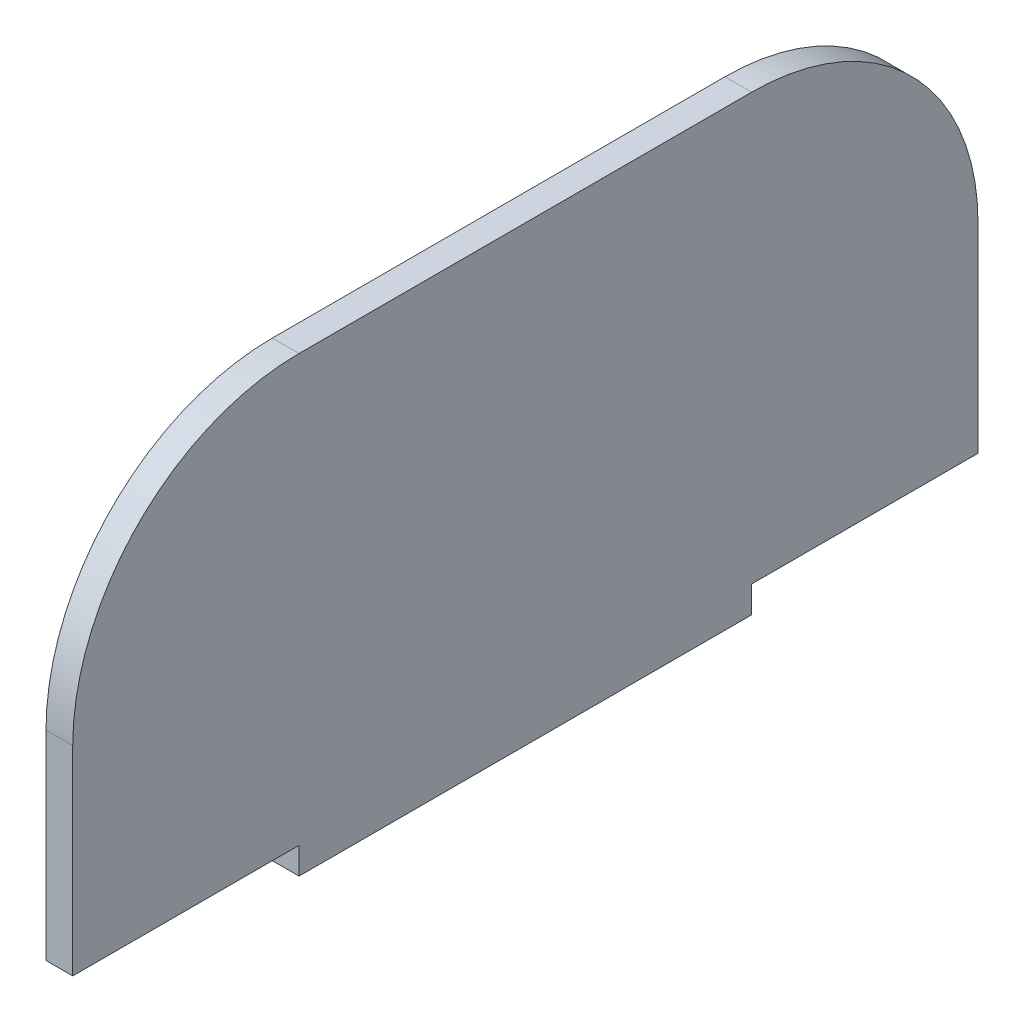
ISO-10303-21;
HEADER;
FILE_DESCRIPTION(('STEP AP214'),'2;1');
FILE_NAME('part.step','',(''),(''),'','','');
FILE_SCHEMA(('AUTOMOTIVE_DESIGN { 1 0 10303 214 1 1 1 1 }'));
ENDSEC;
DATA;
#1=APPLICATION_CONTEXT('core data for automotive mechanical design processes');
#2=APPLICATION_PROTOCOL_DEFINITION('international standard','automotive_design',2000,#1);
#3=PRODUCT_CONTEXT('',#1,'mechanical');
#4=PRODUCT('Part','Part','',(#3));
#5=PRODUCT_RELATED_PRODUCT_CATEGORY('part','',(#4));
#6=PRODUCT_DEFINITION_FORMATION('','',#4);
#7=PRODUCT_DEFINITION_CONTEXT('part definition',#1,'design');
#8=PRODUCT_DEFINITION('design','',#6,#7);
#9=PRODUCT_DEFINITION_SHAPE('','',#8);
#10=(LENGTH_UNIT() NAMED_UNIT(*) SI_UNIT(.MILLI.,.METRE.));
#11=(NAMED_UNIT(*) PLANE_ANGLE_UNIT() SI_UNIT($,.RADIAN.));
#12=(NAMED_UNIT(*) SI_UNIT($,.STERADIAN.) SOLID_ANGLE_UNIT());
#13=UNCERTAINTY_MEASURE_WITH_UNIT(LENGTH_MEASURE(1.E-05),#10,'distance_accuracy_value','');
#14=(GEOMETRIC_REPRESENTATION_CONTEXT(3) GLOBAL_UNCERTAINTY_ASSIGNED_CONTEXT((#13)) GLOBAL_UNIT_ASSIGNED_CONTEXT((#10,
#11,#12)) REPRESENTATION_CONTEXT('',''));
#15=CARTESIAN_POINT('',(0.,0.,0.));
#16=DIRECTION('',(0.,0.,1.));
#17=DIRECTION('',(1.,0.,0.));
#18=AXIS2_PLACEMENT_3D('',#15,#16,#17);
#19=CARTESIAN_POINT('',(3.,0.,0.));
#20=DIRECTION('',(0.,0.,-1.));
#21=DIRECTION('',(-1.,0.,0.));
#22=AXIS2_PLACEMENT_3D('',#19,#20,#21);
#23=PLANE('',#22);
#24=DIRECTION('',(0.,-1.,0.));
#25=VECTOR('',#24,1.);
#26=CARTESIAN_POINT('',(0.,0.,0.));
#27=LINE('',#26,#25);
#28=CARTESIAN_POINT('',(0.,25.4,0.));
#29=VERTEX_POINT('',#28);
#30=CARTESIAN_POINT('',(0.,3.,0.));
#31=VERTEX_POINT('',#30);
#32=EDGE_CURVE('E132',#29,#31,#27,.T.);
#33=ORIENTED_EDGE('',*,*,#32,.T.);
#34=DIRECTION('',(1.,0.,0.));
#35=VECTOR('',#34,1.);
#36=CARTESIAN_POINT('',(0.,3.,0.));
#37=LINE('',#36,#35);
#38=CARTESIAN_POINT('',(3.,3.,0.));
#39=VERTEX_POINT('',#38);
#40=EDGE_CURVE('E137',#31,#39,#37,.T.);
#41=ORIENTED_EDGE('',*,*,#40,.T.);
#42=DIRECTION('',(0.,-1.,0.));
#43=VECTOR('',#42,1.);
#44=CARTESIAN_POINT('',(3.,0.,0.));
#45=LINE('',#44,#43);
#46=CARTESIAN_POINT('',(3.,25.4,0.));
#47=VERTEX_POINT('',#46);
#48=EDGE_CURVE('E143',#47,#39,#45,.T.);
#49=ORIENTED_EDGE('',*,*,#48,.F.);
#50=DIRECTION('',(-1.,0.,0.));
#51=VECTOR('',#50,1.);
#52=CARTESIAN_POINT('',(3.,25.4,0.));
#53=LINE('',#52,#51);
#54=EDGE_CURVE('E11',#47,#29,#53,.T.);
#55=ORIENTED_EDGE('',*,*,#54,.T.);
#56=EDGE_LOOP('',(#33,#41,#49,#55));
#57=FACE_BOUND('',#56,.T.);
#58=ADVANCED_FACE('F33',(#57),#23,.F.);
#59=CARTESIAN_POINT('',(3.,0.,0.));
#60=DIRECTION('',(0.,1.,0.));
#61=DIRECTION('',(0.,0.,1.));
#62=AXIS2_PLACEMENT_3D('',#59,#60,#61);
#63=PLANE('',#62);
#64=DIRECTION('',(0.,0.,-1.));
#65=VECTOR('',#64,1.);
#66=CARTESIAN_POINT('',(3.,0.,0.));
#67=LINE('',#66,#65);
#68=CARTESIAN_POINT('',(3.,0.,-25.4));
#69=VERTEX_POINT('',#68);
#70=CARTESIAN_POINT('',(3.,0.,-76.2));
#71=VERTEX_POINT('',#70);
#72=EDGE_CURVE('E127',#69,#71,#67,.T.);
#73=ORIENTED_EDGE('',*,*,#72,.F.);
#74=DIRECTION('',(1.,0.,0.));
#75=VECTOR('',#74,1.);
#76=CARTESIAN_POINT('',(0.,0.,-25.4));
#77=LINE('',#76,#75);
#78=CARTESIAN_POINT('',(0.,0.,-25.4));
#79=VERTEX_POINT('',#78);
#80=EDGE_CURVE('E113',#79,#69,#77,.T.);
#81=ORIENTED_EDGE('',*,*,#80,.F.);
#82=DIRECTION('',(0.,0.,-1.));
#83=VECTOR('',#82,1.);
#84=CARTESIAN_POINT('',(0.,0.,0.));
#85=LINE('',#84,#83);
#86=CARTESIAN_POINT('',(0.,0.,-76.2));
#87=VERTEX_POINT('',#86);
#88=EDGE_CURVE('E125',#79,#87,#85,.T.);
#89=ORIENTED_EDGE('',*,*,#88,.T.);
#90=DIRECTION('',(1.,0.,0.));
#91=VECTOR('',#90,1.);
#92=CARTESIAN_POINT('',(0.,0.,-76.2));
#93=LINE('',#92,#91);
#94=EDGE_CURVE('E193',#87,#71,#93,.T.);
#95=ORIENTED_EDGE('',*,*,#94,.T.);
#96=EDGE_LOOP('',(#73,#81,#89,#95));
#97=FACE_BOUND('',#96,.T.);
#98=ADVANCED_FACE('F123',(#97),#63,.F.);
#99=CARTESIAN_POINT('',(3.,0.,-101.6));
#100=DIRECTION('',(0.,0.,1.));
#101=DIRECTION('',(1.,0.,0.));
#102=AXIS2_PLACEMENT_3D('',#99,#100,#101);
#103=PLANE('',#102);
#104=DIRECTION('',(0.,1.,0.));
#105=VECTOR('',#104,1.);
#106=CARTESIAN_POINT('',(3.,0.,-101.6));
#107=LINE('',#106,#105);
#108=CARTESIAN_POINT('',(3.,3.,-101.6));
#109=VERTEX_POINT('',#108);
#110=CARTESIAN_POINT('',(3.,25.4,-101.6));
#111=VERTEX_POINT('',#110);
#112=EDGE_CURVE('E168',#109,#111,#107,.T.);
#113=ORIENTED_EDGE('',*,*,#112,.F.);
#114=DIRECTION('',(1.,0.,0.));
#115=VECTOR('',#114,1.);
#116=CARTESIAN_POINT('',(0.,3.,-101.6));
#117=LINE('',#116,#115);
#118=CARTESIAN_POINT('',(0.,3.,-101.6));
#119=VERTEX_POINT('',#118);
#120=EDGE_CURVE('E188',#119,#109,#117,.T.);
#121=ORIENTED_EDGE('',*,*,#120,.F.);
#122=DIRECTION('',(0.,1.,0.));
#123=VECTOR('',#122,1.);
#124=CARTESIAN_POINT('',(0.,0.,-101.6));
#125=LINE('',#124,#123);
#126=CARTESIAN_POINT('',(0.,25.4,-101.6));
#127=VERTEX_POINT('',#126);
#128=EDGE_CURVE('E131',#119,#127,#125,.T.);
#129=ORIENTED_EDGE('',*,*,#128,.T.);
#130=DIRECTION('',(-1.,0.,0.));
#131=VECTOR('',#130,1.);
#132=CARTESIAN_POINT('',(3.,25.4,-101.6));
#133=LINE('',#132,#131);
#134=EDGE_CURVE('E155',#127,#111,#133,.F.);
#135=ORIENTED_EDGE('',*,*,#134,.T.);
#136=EDGE_LOOP('',(#113,#121,#129,#135));
#137=FACE_BOUND('',#136,.T.);
#138=ADVANCED_FACE('F225',(#137),#103,.F.);
#139=CARTESIAN_POINT('',(3.,50.8,0.));
#140=DIRECTION('',(0.,-1.,0.));
#141=DIRECTION('',(0.,0.,-1.));
#142=AXIS2_PLACEMENT_3D('',#139,#140,#141);
#143=PLANE('',#142);
#144=DIRECTION('',(0.,0.,1.));
#145=VECTOR('',#144,1.);
#146=CARTESIAN_POINT('',(3.,50.8,0.));
#147=LINE('',#146,#145);
#148=CARTESIAN_POINT('',(3.,50.8,-76.2));
#149=VERTEX_POINT('',#148);
#150=CARTESIAN_POINT('',(3.,50.8,-25.4));
#151=VERTEX_POINT('',#150);
#152=EDGE_CURVE('E147',#149,#151,#147,.T.);
#153=ORIENTED_EDGE('',*,*,#152,.F.);
#154=DIRECTION('',(-1.,0.,0.));
#155=VECTOR('',#154,1.);
#156=CARTESIAN_POINT('',(3.,50.8,-76.2));
#157=LINE('',#156,#155);
#158=CARTESIAN_POINT('',(0.,50.8,-76.2));
#159=VERTEX_POINT('',#158);
#160=EDGE_CURVE('E146',#149,#159,#157,.T.);
#161=ORIENTED_EDGE('',*,*,#160,.T.);
#162=DIRECTION('',(0.,0.,1.));
#163=VECTOR('',#162,1.);
#164=CARTESIAN_POINT('',(0.,50.8,0.));
#165=LINE('',#164,#163);
#166=CARTESIAN_POINT('',(0.,50.8,-25.4));
#167=VERTEX_POINT('',#166);
#168=EDGE_CURVE('E134',#159,#167,#165,.T.);
#169=ORIENTED_EDGE('',*,*,#168,.T.);
#170=DIRECTION('',(-1.,0.,0.));
#171=VECTOR('',#170,1.);
#172=CARTESIAN_POINT('',(3.,50.8,-25.4));
#173=LINE('',#172,#171);
#174=EDGE_CURVE('E144',#167,#151,#173,.F.);
#175=ORIENTED_EDGE('',*,*,#174,.T.);
#176=EDGE_LOOP('',(#153,#161,#169,#175));
#177=FACE_BOUND('',#176,.T.);
#178=ADVANCED_FACE('F173',(#177),#143,.F.);
#179=CARTESIAN_POINT('',(3.,0.,0.));
#180=DIRECTION('',(-1.,0.,0.));
#181=DIRECTION('',(0.,0.,1.));
#182=AXIS2_PLACEMENT_3D('',#179,#180,#181);
#183=PLANE('',#182);
#184=ORIENTED_EDGE('',*,*,#48,.T.);
#185=DIRECTION('',(0.,0.,1.));
#186=VECTOR('',#185,1.);
#187=CARTESIAN_POINT('',(3.,3.,0.));
#188=LINE('',#187,#186);
#189=CARTESIAN_POINT('',(3.,3.,-25.4));
#190=VERTEX_POINT('',#189);
#191=EDGE_CURVE('E118',#190,#39,#188,.T.);
#192=ORIENTED_EDGE('',*,*,#191,.F.);
#193=DIRECTION('',(0.,1.,0.));
#194=VECTOR('',#193,1.);
#195=CARTESIAN_POINT('',(3.,0.,-25.4));
#196=LINE('',#195,#194);
#197=EDGE_CURVE('E195',#69,#190,#196,.T.);
#198=ORIENTED_EDGE('',*,*,#197,.F.);
#199=ORIENTED_EDGE('',*,*,#72,.T.);
#200=DIRECTION('',(0.,-1.,0.));
#201=VECTOR('',#200,1.);
#202=CARTESIAN_POINT('',(3.,0.,-76.2));
#203=LINE('',#202,#201);
#204=CARTESIAN_POINT('',(3.,3.,-76.2));
#205=VERTEX_POINT('',#204);
#206=EDGE_CURVE('E196',#205,#71,#203,.T.);
#207=ORIENTED_EDGE('',*,*,#206,.F.);
#208=DIRECTION('',(0.,0.,1.));
#209=VECTOR('',#208,1.);
#210=CARTESIAN_POINT('',(3.,3.,-101.6));
#211=LINE('',#210,#209);
#212=EDGE_CURVE('E199',#109,#205,#211,.T.);
#213=ORIENTED_EDGE('',*,*,#212,.F.);
#214=ORIENTED_EDGE('',*,*,#112,.T.);
#215=CARTESIAN_POINT('',(3.,25.4,-76.2));
#216=DIRECTION('',(-1.,0.,0.));
#217=DIRECTION('',(0.,0.,1.));
#218=AXIS2_PLACEMENT_3D('',#215,#216,#217);
#219=CIRCLE('',#218,25.4);
#220=EDGE_CURVE('E41',#111,#149,#219,.F.);
#221=ORIENTED_EDGE('',*,*,#220,.T.);
#222=ORIENTED_EDGE('',*,*,#152,.T.);
#223=CARTESIAN_POINT('',(3.,25.4,-25.4));
#224=DIRECTION('',(-1.,0.,0.));
#225=DIRECTION('',(0.,0.,1.));
#226=AXIS2_PLACEMENT_3D('',#223,#224,#225);
#227=CIRCLE('',#226,25.4);
#228=EDGE_CURVE('E158',#151,#47,#227,.F.);
#229=ORIENTED_EDGE('',*,*,#228,.T.);
#230=EDGE_LOOP('',(#184,#192,#198,#199,#207,#213,#214,#221,#222,#229));
#231=FACE_BOUND('',#230,.T.);
#232=ADVANCED_FACE('F164',(#231),#183,.F.);
#233=CARTESIAN_POINT('',(0.,0.,0.));
#234=DIRECTION('',(-1.,0.,0.));
#235=DIRECTION('',(0.,0.,1.));
#236=AXIS2_PLACEMENT_3D('',#233,#234,#235);
#237=PLANE('',#236);
#238=DIRECTION('',(0.,0.,1.));
#239=VECTOR('',#238,1.);
#240=CARTESIAN_POINT('',(0.,3.,0.));
#241=LINE('',#240,#239);
#242=CARTESIAN_POINT('',(0.,3.,-25.4));
#243=VERTEX_POINT('',#242);
#244=EDGE_CURVE('E48',#243,#31,#241,.T.);
#245=ORIENTED_EDGE('',*,*,#244,.T.);
#246=ORIENTED_EDGE('',*,*,#32,.F.);
#247=CARTESIAN_POINT('',(0.,25.4,-25.4));
#248=DIRECTION('',(-1.,0.,0.));
#249=DIRECTION('',(0.,0.,1.));
#250=AXIS2_PLACEMENT_3D('',#247,#248,#249);
#251=CIRCLE('',#250,25.4);
#252=EDGE_CURVE('E150',#29,#167,#251,.T.);
#253=ORIENTED_EDGE('',*,*,#252,.T.);
#254=ORIENTED_EDGE('',*,*,#168,.F.);
#255=CARTESIAN_POINT('',(0.,25.4,-76.2));
#256=DIRECTION('',(-1.,0.,0.));
#257=DIRECTION('',(0.,0.,1.));
#258=AXIS2_PLACEMENT_3D('',#255,#256,#257);
#259=CIRCLE('',#258,25.4);
#260=EDGE_CURVE('E152',#159,#127,#259,.T.);
#261=ORIENTED_EDGE('',*,*,#260,.T.);
#262=ORIENTED_EDGE('',*,*,#128,.F.);
#263=DIRECTION('',(0.,0.,1.));
#264=VECTOR('',#263,1.);
#265=CARTESIAN_POINT('',(0.,3.,-101.6));
#266=LINE('',#265,#264);
#267=CARTESIAN_POINT('',(0.,3.,-76.2));
#268=VERTEX_POINT('',#267);
#269=EDGE_CURVE('E198',#119,#268,#266,.T.);
#270=ORIENTED_EDGE('',*,*,#269,.T.);
#271=DIRECTION('',(0.,-1.,0.));
#272=VECTOR('',#271,1.);
#273=CARTESIAN_POINT('',(0.,0.,-76.2));
#274=LINE('',#273,#272);
#275=EDGE_CURVE('E56',#268,#87,#274,.T.);
#276=ORIENTED_EDGE('',*,*,#275,.T.);
#277=ORIENTED_EDGE('',*,*,#88,.F.);
#278=DIRECTION('',(0.,1.,0.));
#279=VECTOR('',#278,1.);
#280=CARTESIAN_POINT('',(0.,0.,-25.4));
#281=LINE('',#280,#279);
#282=EDGE_CURVE('E109',#79,#243,#281,.T.);
#283=ORIENTED_EDGE('',*,*,#282,.T.);
#284=EDGE_LOOP('',(#245,#246,#253,#254,#261,#262,#270,#276,#277,#283));
#285=FACE_BOUND('',#284,.T.);
#286=ADVANCED_FACE('F129',(#285),#237,.T.);
#287=CARTESIAN_POINT('',(3.,25.4,-76.2));
#288=DIRECTION('',(-1.,0.,0.));
#289=DIRECTION('',(0.,0.,1.));
#290=AXIS2_PLACEMENT_3D('',#287,#288,#289);
#291=CYLINDRICAL_SURFACE('',#290,25.4);
#292=ORIENTED_EDGE('',*,*,#220,.F.);
#293=ORIENTED_EDGE('',*,*,#134,.F.);
#294=ORIENTED_EDGE('',*,*,#260,.F.);
#295=ORIENTED_EDGE('',*,*,#160,.F.);
#296=EDGE_LOOP('',(#292,#293,#294,#295));
#297=FACE_BOUND('',#296,.T.);
#298=ADVANCED_FACE('F176',(#297),#291,.T.);
#299=CARTESIAN_POINT('',(3.,25.4,-25.4));
#300=DIRECTION('',(-1.,0.,0.));
#301=DIRECTION('',(0.,0.,1.));
#302=AXIS2_PLACEMENT_3D('',#299,#300,#301);
#303=CYLINDRICAL_SURFACE('',#302,25.4);
#304=ORIENTED_EDGE('',*,*,#228,.F.);
#305=ORIENTED_EDGE('',*,*,#174,.F.);
#306=ORIENTED_EDGE('',*,*,#252,.F.);
#307=ORIENTED_EDGE('',*,*,#54,.F.);
#308=EDGE_LOOP('',(#304,#305,#306,#307));
#309=FACE_BOUND('',#308,.T.);
#310=ADVANCED_FACE('F35',(#309),#303,.T.);
#311=CARTESIAN_POINT('',(0.,0.,-76.2));
#312=DIRECTION('',(0.,0.,1.));
#313=DIRECTION('',(1.,0.,0.));
#314=AXIS2_PLACEMENT_3D('',#311,#312,#313);
#315=PLANE('',#314);
#316=ORIENTED_EDGE('',*,*,#206,.T.);
#317=ORIENTED_EDGE('',*,*,#94,.F.);
#318=ORIENTED_EDGE('',*,*,#275,.F.);
#319=DIRECTION('',(1.,0.,0.));
#320=VECTOR('',#319,1.);
#321=CARTESIAN_POINT('',(0.,3.,-76.2));
#322=LINE('',#321,#320);
#323=EDGE_CURVE('E191',#268,#205,#322,.T.);
#324=ORIENTED_EDGE('',*,*,#323,.T.);
#325=EDGE_LOOP('',(#316,#317,#318,#324));
#326=FACE_BOUND('',#325,.T.);
#327=ADVANCED_FACE('F217',(#326),#315,.F.);
#328=CARTESIAN_POINT('',(0.,3.,-101.6));
#329=DIRECTION('',(0.,1.,0.));
#330=DIRECTION('',(0.,0.,1.));
#331=AXIS2_PLACEMENT_3D('',#328,#329,#330);
#332=PLANE('',#331);
#333=ORIENTED_EDGE('',*,*,#212,.T.);
#334=ORIENTED_EDGE('',*,*,#323,.F.);
#335=ORIENTED_EDGE('',*,*,#269,.F.);
#336=ORIENTED_EDGE('',*,*,#120,.T.);
#337=EDGE_LOOP('',(#333,#334,#335,#336));
#338=FACE_BOUND('',#337,.T.);
#339=ADVANCED_FACE('F210',(#338),#332,.F.);
#340=CARTESIAN_POINT('',(0.,3.,0.));
#341=DIRECTION('',(0.,1.,0.));
#342=DIRECTION('',(0.,0.,1.));
#343=AXIS2_PLACEMENT_3D('',#340,#341,#342);
#344=PLANE('',#343);
#345=ORIENTED_EDGE('',*,*,#191,.T.);
#346=ORIENTED_EDGE('',*,*,#40,.F.);
#347=ORIENTED_EDGE('',*,*,#244,.F.);
#348=DIRECTION('',(1.,0.,0.));
#349=VECTOR('',#348,1.);
#350=CARTESIAN_POINT('',(0.,3.,-25.4));
#351=LINE('',#350,#349);
#352=EDGE_CURVE('E115',#243,#190,#351,.T.);
#353=ORIENTED_EDGE('',*,*,#352,.T.);
#354=EDGE_LOOP('',(#345,#346,#347,#353));
#355=FACE_BOUND('',#354,.T.);
#356=ADVANCED_FACE('F208',(#355),#344,.F.);
#357=CARTESIAN_POINT('',(0.,0.,-25.4));
#358=DIRECTION('',(0.,0.,-1.));
#359=DIRECTION('',(-1.,0.,0.));
#360=AXIS2_PLACEMENT_3D('',#357,#358,#359);
#361=PLANE('',#360);
#362=ORIENTED_EDGE('',*,*,#197,.T.);
#363=ORIENTED_EDGE('',*,*,#352,.F.);
#364=ORIENTED_EDGE('',*,*,#282,.F.);
#365=ORIENTED_EDGE('',*,*,#80,.T.);
#366=EDGE_LOOP('',(#362,#363,#364,#365));
#367=FACE_BOUND('',#366,.T.);
#368=ADVANCED_FACE('F112',(#367),#361,.F.);
#369=CLOSED_SHELL('',(#58,#98,#138,#178,#232,#286,#298,#310,#327,#339,#356,#368));
#370=MANIFOLD_SOLID_BREP('B2',#369);
#371=ADVANCED_BREP_SHAPE_REPRESENTATION('',(#18,#370),#14);
#372=SHAPE_DEFINITION_REPRESENTATION(#9,#371);
ENDSEC;
END-ISO-10303-21;
